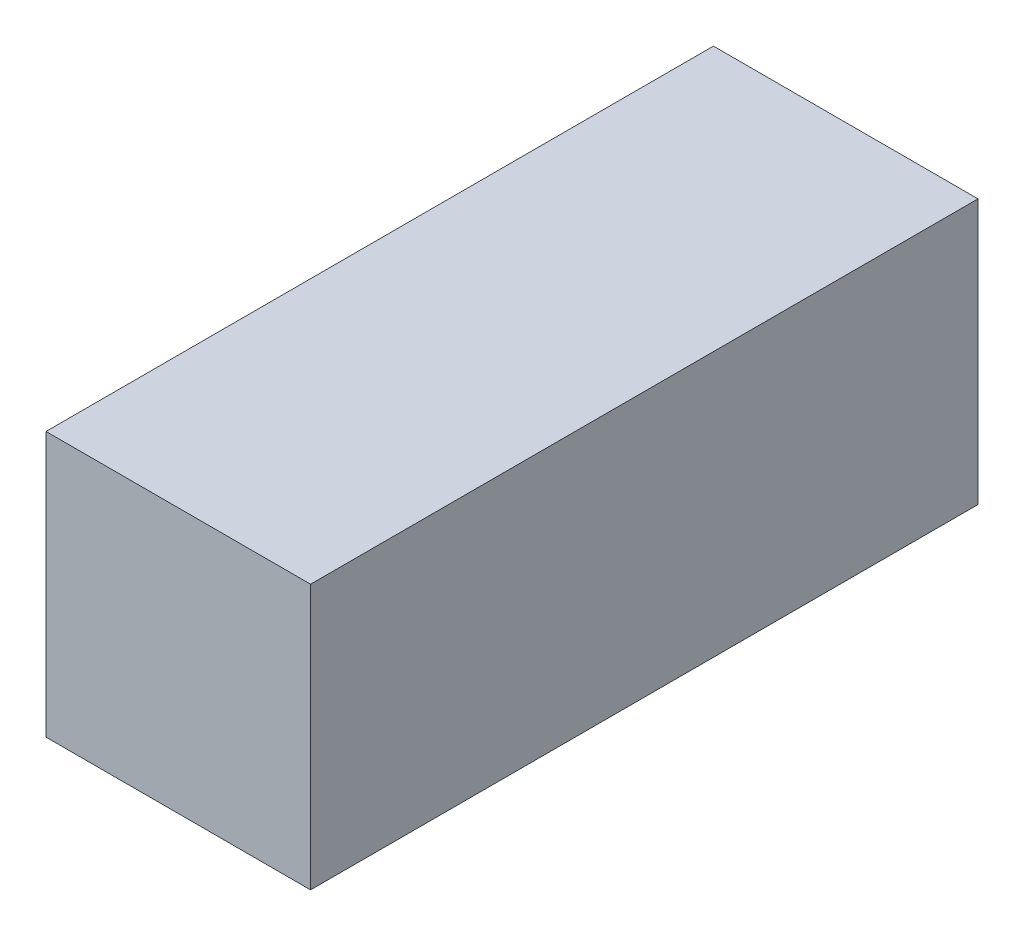
ISO-10303-21;
HEADER;
FILE_DESCRIPTION(('STEP AP214'),'2;1');
FILE_NAME('part.step','',(''),(''),'','','');
FILE_SCHEMA(('AUTOMOTIVE_DESIGN { 1 0 10303 214 1 1 1 1 }'));
ENDSEC;
DATA;
#1=APPLICATION_CONTEXT('core data for automotive mechanical design processes');
#2=APPLICATION_PROTOCOL_DEFINITION('international standard','automotive_design',2000,#1);
#3=PRODUCT_CONTEXT('',#1,'mechanical');
#4=PRODUCT('Part','Part','',(#3));
#5=PRODUCT_RELATED_PRODUCT_CATEGORY('part','',(#4));
#6=PRODUCT_DEFINITION_FORMATION('','',#4);
#7=PRODUCT_DEFINITION_CONTEXT('part definition',#1,'design');
#8=PRODUCT_DEFINITION('design','',#6,#7);
#9=PRODUCT_DEFINITION_SHAPE('','',#8);
#10=(LENGTH_UNIT() NAMED_UNIT(*) SI_UNIT(.MILLI.,.METRE.));
#11=(NAMED_UNIT(*) PLANE_ANGLE_UNIT() SI_UNIT($,.RADIAN.));
#12=(NAMED_UNIT(*) SI_UNIT($,.STERADIAN.) SOLID_ANGLE_UNIT());
#13=UNCERTAINTY_MEASURE_WITH_UNIT(LENGTH_MEASURE(1.E-05),#10,'distance_accuracy_value','');
#14=(GEOMETRIC_REPRESENTATION_CONTEXT(3) GLOBAL_UNCERTAINTY_ASSIGNED_CONTEXT((#13)) GLOBAL_UNIT_ASSIGNED_CONTEXT((#10,
#11,#12)) REPRESENTATION_CONTEXT('',''));
#15=CARTESIAN_POINT('',(0.,0.,0.));
#16=DIRECTION('',(0.,0.,1.));
#17=DIRECTION('',(1.,0.,0.));
#18=AXIS2_PLACEMENT_3D('',#15,#16,#17);
#19=CARTESIAN_POINT('',(-9.243,2.0275,-21.));
#20=DIRECTION('',(1.,0.,0.));
#21=DIRECTION('',(0.,0.,-1.));
#22=AXIS2_PLACEMENT_3D('',#19,#20,#21);
#23=PLANE('',#22);
#24=DIRECTION('',(0.,-1.,0.));
#25=VECTOR('',#24,1.);
#26=CARTESIAN_POINT('',(-9.243,2.0275,-22.6));
#27=LINE('',#26,#25);
#28=CARTESIAN_POINT('',(-9.243,2.0275,-22.6));
#29=VERTEX_POINT('',#28);
#30=CARTESIAN_POINT('',(-9.243,1.39283601788177,-22.6));
#31=VERTEX_POINT('',#30);
#32=EDGE_CURVE('E11',#29,#31,#27,.T.);
#33=ORIENTED_EDGE('',*,*,#32,.T.);
#34=DIRECTION('',(0.,0.,-1.));
#35=VECTOR('',#34,1.);
#36=CARTESIAN_POINT('',(-9.243,1.39283601788177,-21.));
#37=LINE('',#36,#35);
#38=CARTESIAN_POINT('',(-9.243,1.39283601788177,-21.));
#39=VERTEX_POINT('',#38);
#40=EDGE_CURVE('E24',#39,#31,#37,.T.);
#41=ORIENTED_EDGE('',*,*,#40,.F.);
#42=DIRECTION('',(0.,-1.,0.));
#43=VECTOR('',#42,1.);
#44=CARTESIAN_POINT('',(-9.243,2.0275,-21.));
#45=LINE('',#44,#43);
#46=CARTESIAN_POINT('',(-9.243,2.0275,-21.));
#47=VERTEX_POINT('',#46);
#48=EDGE_CURVE('E88',#47,#39,#45,.T.);
#49=ORIENTED_EDGE('',*,*,#48,.F.);
#50=DIRECTION('',(0.,0.,-1.));
#51=VECTOR('',#50,1.);
#52=CARTESIAN_POINT('',(-9.243,2.0275,-21.));
#53=LINE('',#52,#51);
#54=EDGE_CURVE('E77',#47,#29,#53,.T.);
#55=ORIENTED_EDGE('',*,*,#54,.T.);
#56=EDGE_LOOP('',(#33,#41,#49,#55));
#57=FACE_BOUND('',#56,.T.);
#58=ADVANCED_FACE('F17',(#57),#23,.F.);
#59=CARTESIAN_POINT('',(-9.243,1.39283601788177,-21.));
#60=DIRECTION('',(0.,1.,0.));
#61=DIRECTION('',(0.,0.,1.));
#62=AXIS2_PLACEMENT_3D('',#59,#60,#61);
#63=PLANE('',#62);
#64=DIRECTION('',(1.,0.,0.));
#65=VECTOR('',#64,1.);
#66=CARTESIAN_POINT('',(-9.243,1.39283601788177,-22.6));
#67=LINE('',#66,#65);
#68=CARTESIAN_POINT('',(-8.60877044054506,1.39283601788177,-22.6));
#69=VERTEX_POINT('',#68);
#70=EDGE_CURVE('E85',#31,#69,#67,.T.);
#71=ORIENTED_EDGE('',*,*,#70,.T.);
#72=DIRECTION('',(0.,0.,-1.));
#73=VECTOR('',#72,1.);
#74=CARTESIAN_POINT('',(-8.60877044054506,1.39283601788177,-21.));
#75=LINE('',#74,#73);
#76=CARTESIAN_POINT('',(-8.60877044054506,1.39283601788177,-21.));
#77=VERTEX_POINT('',#76);
#78=EDGE_CURVE('E83',#77,#69,#75,.T.);
#79=ORIENTED_EDGE('',*,*,#78,.F.);
#80=DIRECTION('',(1.,0.,0.));
#81=VECTOR('',#80,1.);
#82=CARTESIAN_POINT('',(-9.243,1.39283601788177,-21.));
#83=LINE('',#82,#81);
#84=EDGE_CURVE('E72',#39,#77,#83,.T.);
#85=ORIENTED_EDGE('',*,*,#84,.F.);
#86=ORIENTED_EDGE('',*,*,#40,.T.);
#87=EDGE_LOOP('',(#71,#79,#85,#86));
#88=FACE_BOUND('',#87,.T.);
#89=ADVANCED_FACE('F90',(#88),#63,.F.);
#90=CARTESIAN_POINT('',(-8.60877044054506,2.0275,-21.));
#91=DIRECTION('',(-1.,0.,0.));
#92=DIRECTION('',(0.,0.,1.));
#93=AXIS2_PLACEMENT_3D('',#90,#91,#92);
#94=PLANE('',#93);
#95=DIRECTION('',(0.,1.,0.));
#96=VECTOR('',#95,1.);
#97=CARTESIAN_POINT('',(-8.60877044054506,2.0275,-22.6));
#98=LINE('',#97,#96);
#99=CARTESIAN_POINT('',(-8.60877044054506,2.0275,-22.6));
#100=VERTEX_POINT('',#99);
#101=EDGE_CURVE('E60',#69,#100,#98,.T.);
#102=ORIENTED_EDGE('',*,*,#101,.T.);
#103=DIRECTION('',(0.,0.,-1.));
#104=VECTOR('',#103,1.);
#105=CARTESIAN_POINT('',(-8.60877044054506,2.0275,-21.));
#106=LINE('',#105,#104);
#107=CARTESIAN_POINT('',(-8.60877044054506,2.0275,-21.));
#108=VERTEX_POINT('',#107);
#109=EDGE_CURVE('E54',#108,#100,#106,.T.);
#110=ORIENTED_EDGE('',*,*,#109,.F.);
#111=DIRECTION('',(0.,1.,0.));
#112=VECTOR('',#111,1.);
#113=CARTESIAN_POINT('',(-8.60877044054506,2.0275,-21.));
#114=LINE('',#113,#112);
#115=EDGE_CURVE('E58',#77,#108,#114,.T.);
#116=ORIENTED_EDGE('',*,*,#115,.F.);
#117=ORIENTED_EDGE('',*,*,#78,.T.);
#118=EDGE_LOOP('',(#102,#110,#116,#117));
#119=FACE_BOUND('',#118,.T.);
#120=ADVANCED_FACE('F56',(#119),#94,.F.);
#121=CARTESIAN_POINT('',(-9.243,2.0275,-21.));
#122=DIRECTION('',(0.,-1.,0.));
#123=DIRECTION('',(0.,0.,-1.));
#124=AXIS2_PLACEMENT_3D('',#121,#122,#123);
#125=PLANE('',#124);
#126=DIRECTION('',(-1.,0.,0.));
#127=VECTOR('',#126,1.);
#128=CARTESIAN_POINT('',(-9.243,2.0275,-22.6));
#129=LINE('',#128,#127);
#130=EDGE_CURVE('E73',#100,#29,#129,.T.);
#131=ORIENTED_EDGE('',*,*,#130,.T.);
#132=ORIENTED_EDGE('',*,*,#54,.F.);
#133=DIRECTION('',(-1.,0.,0.));
#134=VECTOR('',#133,1.);
#135=CARTESIAN_POINT('',(-9.243,2.0275,-21.));
#136=LINE('',#135,#134);
#137=EDGE_CURVE('E70',#108,#47,#136,.T.);
#138=ORIENTED_EDGE('',*,*,#137,.F.);
#139=ORIENTED_EDGE('',*,*,#109,.T.);
#140=EDGE_LOOP('',(#131,#132,#138,#139));
#141=FACE_BOUND('',#140,.T.);
#142=ADVANCED_FACE('F76',(#141),#125,.F.);
#143=CARTESIAN_POINT('',(0.,0.,-21.));
#144=DIRECTION('',(0.,0.,1.));
#145=DIRECTION('',(1.,0.,0.));
#146=AXIS2_PLACEMENT_3D('',#143,#144,#145);
#147=PLANE('',#146);
#148=ORIENTED_EDGE('',*,*,#48,.T.);
#149=ORIENTED_EDGE('',*,*,#84,.T.);
#150=ORIENTED_EDGE('',*,*,#115,.T.);
#151=ORIENTED_EDGE('',*,*,#137,.T.);
#152=EDGE_LOOP('',(#148,#149,#150,#151));
#153=FACE_BOUND('',#152,.T.);
#154=ADVANCED_FACE('F69',(#153),#147,.T.);
#155=CARTESIAN_POINT('',(0.,0.,-22.6));
#156=DIRECTION('',(0.,0.,1.));
#157=DIRECTION('',(1.,0.,0.));
#158=AXIS2_PLACEMENT_3D('',#155,#156,#157);
#159=PLANE('',#158);
#160=ORIENTED_EDGE('',*,*,#32,.F.);
#161=ORIENTED_EDGE('',*,*,#130,.F.);
#162=ORIENTED_EDGE('',*,*,#101,.F.);
#163=ORIENTED_EDGE('',*,*,#70,.F.);
#164=EDGE_LOOP('',(#160,#161,#162,#163));
#165=FACE_BOUND('',#164,.T.);
#166=ADVANCED_FACE('F91',(#165),#159,.F.);
#167=CLOSED_SHELL('',(#58,#89,#120,#142,#154,#166));
#168=MANIFOLD_SOLID_BREP('B1',#167);
#169=ADVANCED_BREP_SHAPE_REPRESENTATION('',(#18,#168),#14);
#170=SHAPE_DEFINITION_REPRESENTATION(#9,#169);
ENDSEC;
END-ISO-10303-21;
